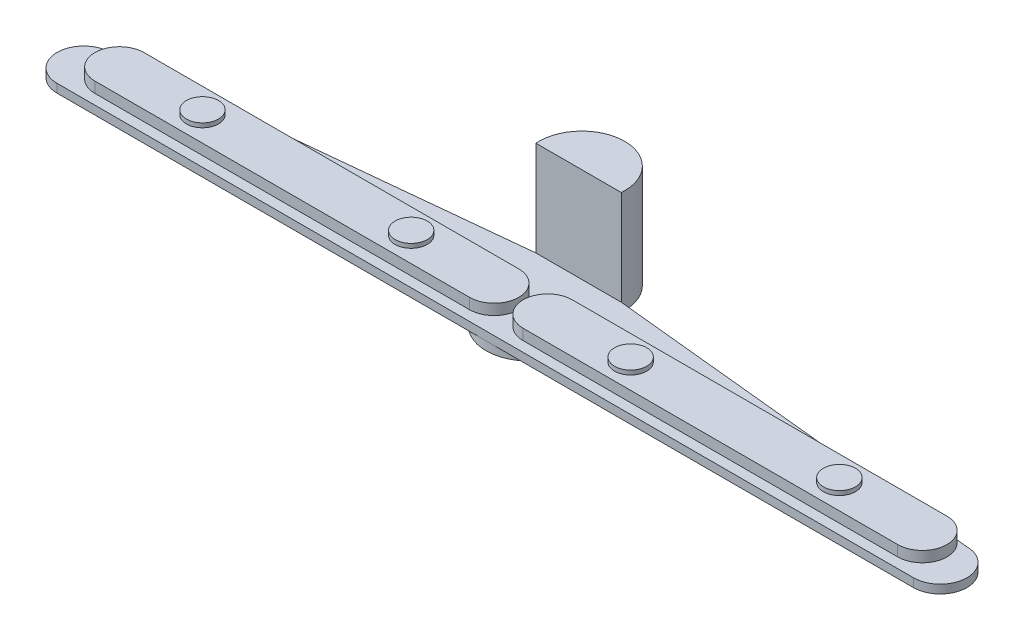
ISO-10303-21;
HEADER;
FILE_DESCRIPTION(('STEP AP214'),'2;1');
FILE_NAME('part.step','',(''),(''),'','','');
FILE_SCHEMA(('AUTOMOTIVE_DESIGN { 1 0 10303 214 1 1 1 1 }'));
ENDSEC;
DATA;
#1=APPLICATION_CONTEXT('core data for automotive mechanical design processes');
#2=APPLICATION_PROTOCOL_DEFINITION('international standard','automotive_design',2000,#1);
#3=PRODUCT_CONTEXT('',#1,'mechanical');
#4=PRODUCT('Part','Part','',(#3));
#5=PRODUCT_RELATED_PRODUCT_CATEGORY('part','',(#4));
#6=PRODUCT_DEFINITION_FORMATION('','',#4);
#7=PRODUCT_DEFINITION_CONTEXT('part definition',#1,'design');
#8=PRODUCT_DEFINITION('design','',#6,#7);
#9=PRODUCT_DEFINITION_SHAPE('','',#8);
#10=(LENGTH_UNIT() NAMED_UNIT(*) SI_UNIT(.MILLI.,.METRE.));
#11=(NAMED_UNIT(*) PLANE_ANGLE_UNIT() SI_UNIT($,.RADIAN.));
#12=(NAMED_UNIT(*) SI_UNIT($,.STERADIAN.) SOLID_ANGLE_UNIT());
#13=UNCERTAINTY_MEASURE_WITH_UNIT(LENGTH_MEASURE(1.E-05),#10,'distance_accuracy_value','');
#14=(GEOMETRIC_REPRESENTATION_CONTEXT(3) GLOBAL_UNCERTAINTY_ASSIGNED_CONTEXT((#13)) GLOBAL_UNIT_ASSIGNED_CONTEXT((#10,
#11,#12)) REPRESENTATION_CONTEXT('',''));
#15=CARTESIAN_POINT('',(0.,0.,0.));
#16=DIRECTION('',(0.,0.,1.));
#17=DIRECTION('',(1.,0.,0.));
#18=AXIS2_PLACEMENT_3D('',#15,#16,#17);
#19=CARTESIAN_POINT('',(-1446.89535492094,40.,407.233116230003));
#20=DIRECTION('',(0.,1.,0.));
#21=DIRECTION('',(0.,0.,1.));
#22=AXIS2_PLACEMENT_3D('',#19,#20,#21);
#23=PLANE('',#22);
#24=DIRECTION('',(-0.994906857184754,0.,-0.100798539308642));
#25=VECTOR('',#24,1.);
#26=CARTESIAN_POINT('',(2553.06053303877,40.,282.233124013492));
#27=LINE('',#26,#25);
#28=CARTESIAN_POINT('',(2281.62856086851,40.,254.733116230003));
#29=VERTEX_POINT('',#28);
#30=CARTESIAN_POINT('',(756.636813568834,40.,100.229265467022));
#31=VERTEX_POINT('',#30);
#32=EDGE_CURVE('E282',#29,#31,#27,.T.);
#33=ORIENTED_EDGE('',*,*,#32,.T.);
#34=DIRECTION('',(1.,0.,0.));
#35=VECTOR('',#34,1.);
#36=CARTESIAN_POINT('',(756.636813568834,40.,100.229265467022));
#37=LINE('',#36,#35);
#38=CARTESIAN_POINT('',(357.756813568834,40.,100.229265467022));
#39=VERTEX_POINT('',#38);
#40=EDGE_CURVE('E170',#39,#31,#37,.T.);
#41=ORIENTED_EDGE('',*,*,#40,.F.);
#42=DIRECTION('',(-0.994891530483461,0.,0.100949703180724));
#43=VECTOR('',#42,1.);
#44=CARTESIAN_POINT('',(-1438.63923170271,40.,282.5060685242));
#45=LINE('',#44,#43);
#46=CARTESIAN_POINT('',(-1164.92792653372,40.,254.733116230003));
#47=VERTEX_POINT('',#46);
#48=EDGE_CURVE('E288',#39,#47,#45,.T.);
#49=ORIENTED_EDGE('',*,*,#48,.T.);
#50=DIRECTION('',(-1.,0.,0.));
#51=VECTOR('',#50,1.);
#52=CARTESIAN_POINT('',(-1317.80318643117,40.,254.733116230003));
#53=LINE('',#52,#51);
#54=CARTESIAN_POINT('',(432.196813568834,40.,254.733116230003));
#55=VERTEX_POINT('',#54);
#56=EDGE_CURVE('E226',#55,#47,#53,.T.);
#57=ORIENTED_EDGE('',*,*,#56,.F.);
#58=CARTESIAN_POINT('',(432.196813568834,40.,369.733116230003));
#59=DIRECTION('',(0.,1.,0.));
#60=DIRECTION('',(0.,0.,1.));
#61=AXIS2_PLACEMENT_3D('',#58,#59,#60);
#62=CIRCLE('',#61,115.);
#63=CARTESIAN_POINT('',(432.196813568834,40.,484.733116230003));
#64=VERTEX_POINT('',#63);
#65=EDGE_CURVE('E209',#64,#55,#62,.T.);
#66=ORIENTED_EDGE('',*,*,#65,.F.);
#67=DIRECTION('',(1.,0.,0.));
#68=VECTOR('',#67,1.);
#69=CARTESIAN_POINT('',(432.196813568834,40.,484.733116230003));
#70=LINE('',#69,#68);
#71=CARTESIAN_POINT('',(-1317.80318643117,40.,484.733116230003));
#72=VERTEX_POINT('',#71);
#73=EDGE_CURVE('E216',#72,#64,#70,.T.);
#74=ORIENTED_EDGE('',*,*,#73,.F.);
#75=CARTESIAN_POINT('',(-1317.80318643117,40.,369.733116230003));
#76=DIRECTION('',(0.,1.,0.));
#77=DIRECTION('',(0.,0.,1.));
#78=AXIS2_PLACEMENT_3D('',#75,#76,#77);
#79=CIRCLE('',#78,115.);
#80=CARTESIAN_POINT('',(-1386.04516728354,40.,277.169451386045));
#81=VERTEX_POINT('',#80);
#82=EDGE_CURVE('E11',#72,#81,#79,.F.);
#83=ORIENTED_EDGE('',*,*,#82,.T.);
#84=CARTESIAN_POINT('',(-1438.63923170271,40.,282.5060685242));
#85=VERTEX_POINT('',#84);
#86=EDGE_CURVE('E286',#81,#85,#45,.T.);
#87=ORIENTED_EDGE('',*,*,#86,.T.);
#88=CARTESIAN_POINT('',(-1446.89535492094,40.,407.233116230003));
#89=DIRECTION('',(0.,1.,0.));
#90=DIRECTION('',(0.,0.,1.));
#91=AXIS2_PLACEMENT_3D('',#88,#89,#90);
#92=CIRCLE('',#91,125.);
#93=CARTESIAN_POINT('',(-1446.89535492094,40.,532.233116230003));
#94=VERTEX_POINT('',#93);
#95=EDGE_CURVE('E274',#85,#94,#92,.T.);
#96=ORIENTED_EDGE('',*,*,#95,.T.);
#97=DIRECTION('',(1.,0.,0.));
#98=VECTOR('',#97,1.);
#99=CARTESIAN_POINT('',(-1446.89535492094,40.,532.233116230003));
#100=LINE('',#99,#98);
#101=CARTESIAN_POINT('',(2553.10464507906,40.,532.233116230002));
#102=VERTEX_POINT('',#101);
#103=EDGE_CURVE('E277',#94,#102,#100,.T.);
#104=ORIENTED_EDGE('',*,*,#103,.T.);
#105=CARTESIAN_POINT('',(2553.10464507906,40.,407.233116230003));
#106=DIRECTION('',(0.,1.,0.));
#107=DIRECTION('',(0.,0.,1.));
#108=AXIS2_PLACEMENT_3D('',#105,#106,#107);
#109=CIRCLE('',#108,125.);
#110=CARTESIAN_POINT('',(2553.06053303877,40.,282.233124013492));
#111=VERTEX_POINT('',#110);
#112=EDGE_CURVE('E280',#102,#111,#109,.T.);
#113=ORIENTED_EDGE('',*,*,#112,.T.);
#114=CARTESIAN_POINT('',(2500.01553383146,40.,276.858893854043));
#115=VERTEX_POINT('',#114);
#116=EDGE_CURVE('E283',#111,#115,#27,.T.);
#117=ORIENTED_EDGE('',*,*,#116,.T.);
#118=CARTESIAN_POINT('',(2432.19681356883,40.,369.733116230003));
#119=DIRECTION('',(0.,1.,0.));
#120=DIRECTION('',(0.,0.,1.));
#121=AXIS2_PLACEMENT_3D('',#118,#119,#120);
#122=CIRCLE('',#121,115.);
#123=CARTESIAN_POINT('',(2432.19681356883,40.,484.733116230003));
#124=VERTEX_POINT('',#123);
#125=EDGE_CURVE('E257',#124,#115,#122,.T.);
#126=ORIENTED_EDGE('',*,*,#125,.F.);
#127=DIRECTION('',(1.,0.,0.));
#128=VECTOR('',#127,1.);
#129=CARTESIAN_POINT('',(682.196813568834,40.,484.733116230003));
#130=LINE('',#129,#128);
#131=CARTESIAN_POINT('',(682.196813568834,40.,484.733116230003));
#132=VERTEX_POINT('',#131);
#133=EDGE_CURVE('E253',#132,#124,#130,.T.);
#134=ORIENTED_EDGE('',*,*,#133,.F.);
#135=CARTESIAN_POINT('',(682.196813568834,40.,369.733116230003));
#136=DIRECTION('',(0.,1.,0.));
#137=DIRECTION('',(0.,0.,1.));
#138=AXIS2_PLACEMENT_3D('',#135,#136,#137);
#139=CIRCLE('',#138,115.);
#140=CARTESIAN_POINT('',(682.196813568834,40.,254.733116230003));
#141=VERTEX_POINT('',#140);
#142=EDGE_CURVE('E56',#141,#132,#139,.T.);
#143=ORIENTED_EDGE('',*,*,#142,.F.);
#144=DIRECTION('',(-1.,0.,0.));
#145=VECTOR('',#144,1.);
#146=CARTESIAN_POINT('',(682.196813568834,40.,254.733116230003));
#147=LINE('',#146,#145);
#148=EDGE_CURVE('E41',#29,#141,#147,.T.);
#149=ORIENTED_EDGE('',*,*,#148,.F.);
#150=EDGE_LOOP('',(#33,#41,#49,#57,#66,#74,#83,#87,#96,#104,#113,#117,#126,#134,#143,#149));
#151=FACE_BOUND('',#150,.T.);
#152=ADVANCED_FACE('F33',(#151),#23,.T.);
#153=CARTESIAN_POINT('',(-1446.89535492094,40.,407.233116230003));
#154=DIRECTION('',(0.,-1.,0.));
#155=DIRECTION('',(0.,0.,-1.));
#156=AXIS2_PLACEMENT_3D('',#153,#154,#155);
#157=CYLINDRICAL_SURFACE('',#156,125.);
#158=CARTESIAN_POINT('',(-1446.89535492094,0.,407.233116230003));
#159=DIRECTION('',(0.,1.,0.));
#160=DIRECTION('',(0.,0.,1.));
#161=AXIS2_PLACEMENT_3D('',#158,#159,#160);
#162=CIRCLE('',#161,125.);
#163=CARTESIAN_POINT('',(-1438.63923170271,0.,282.5060685242));
#164=VERTEX_POINT('',#163);
#165=CARTESIAN_POINT('',(-1446.89535492094,0.,532.233116230003));
#166=VERTEX_POINT('',#165);
#167=EDGE_CURVE('E273',#164,#166,#162,.T.);
#168=ORIENTED_EDGE('',*,*,#167,.T.);
#169=DIRECTION('',(0.,-1.,0.));
#170=VECTOR('',#169,1.);
#171=CARTESIAN_POINT('',(-1446.89535492094,40.,532.233116230003));
#172=LINE('',#171,#170);
#173=EDGE_CURVE('E316',#94,#166,#172,.T.);
#174=ORIENTED_EDGE('',*,*,#173,.F.);
#175=ORIENTED_EDGE('',*,*,#95,.F.);
#176=DIRECTION('',(0.,-1.,0.));
#177=VECTOR('',#176,1.);
#178=CARTESIAN_POINT('',(-1438.63923170271,40.,282.5060685242));
#179=LINE('',#178,#177);
#180=EDGE_CURVE('E291',#85,#164,#179,.T.);
#181=ORIENTED_EDGE('',*,*,#180,.T.);
#182=EDGE_LOOP('',(#168,#174,#175,#181));
#183=FACE_BOUND('',#182,.T.);
#184=ADVANCED_FACE('F35',(#183),#157,.T.);
#185=CARTESIAN_POINT('',(-1446.89535492094,40.,532.233116230003));
#186=DIRECTION('',(0.,0.,-1.));
#187=DIRECTION('',(-1.,0.,0.));
#188=AXIS2_PLACEMENT_3D('',#185,#186,#187);
#189=PLANE('',#188);
#190=DIRECTION('',(1.,0.,0.));
#191=VECTOR('',#190,1.);
#192=CARTESIAN_POINT('',(-1446.89535492094,0.,532.233116230003));
#193=LINE('',#192,#191);
#194=CARTESIAN_POINT('',(557.196813568834,0.,532.233116230002));
#195=VERTEX_POINT('',#194);
#196=EDGE_CURVE('E296',#166,#195,#193,.T.);
#197=ORIENTED_EDGE('',*,*,#196,.T.);
#198=CARTESIAN_POINT('',(2553.10464507906,0.,532.233116230002));
#199=VERTEX_POINT('',#198);
#200=EDGE_CURVE('E295',#195,#199,#193,.T.);
#201=ORIENTED_EDGE('',*,*,#200,.T.);
#202=DIRECTION('',(0.,-1.,0.));
#203=VECTOR('',#202,1.);
#204=CARTESIAN_POINT('',(2553.10464507906,40.,532.233116230002));
#205=LINE('',#204,#203);
#206=EDGE_CURVE('E314',#102,#199,#205,.T.);
#207=ORIENTED_EDGE('',*,*,#206,.F.);
#208=ORIENTED_EDGE('',*,*,#103,.F.);
#209=ORIENTED_EDGE('',*,*,#173,.T.);
#210=EDGE_LOOP('',(#197,#201,#207,#208,#209));
#211=FACE_BOUND('',#210,.T.);
#212=ADVANCED_FACE('F400',(#211),#189,.F.);
#213=CARTESIAN_POINT('',(2553.10464507906,40.,407.233116230003));
#214=DIRECTION('',(0.,-1.,0.));
#215=DIRECTION('',(0.,0.,-1.));
#216=AXIS2_PLACEMENT_3D('',#213,#214,#215);
#217=CYLINDRICAL_SURFACE('',#216,125.);
#218=CARTESIAN_POINT('',(2553.10464507906,0.,407.233116230003));
#219=DIRECTION('',(0.,1.,0.));
#220=DIRECTION('',(0.,0.,1.));
#221=AXIS2_PLACEMENT_3D('',#218,#219,#220);
#222=CIRCLE('',#221,125.);
#223=CARTESIAN_POINT('',(2553.06053303877,0.,282.233124013492));
#224=VERTEX_POINT('',#223);
#225=EDGE_CURVE('E298',#199,#224,#222,.T.);
#226=ORIENTED_EDGE('',*,*,#225,.T.);
#227=DIRECTION('',(0.,-1.,0.));
#228=VECTOR('',#227,1.);
#229=CARTESIAN_POINT('',(2553.06053303877,40.,282.233124013492));
#230=LINE('',#229,#228);
#231=EDGE_CURVE('E311',#111,#224,#230,.T.);
#232=ORIENTED_EDGE('',*,*,#231,.F.);
#233=ORIENTED_EDGE('',*,*,#112,.F.);
#234=ORIENTED_EDGE('',*,*,#206,.T.);
#235=EDGE_LOOP('',(#226,#232,#233,#234));
#236=FACE_BOUND('',#235,.T.);
#237=ADVANCED_FACE('F412',(#236),#217,.T.);
#238=CARTESIAN_POINT('',(2553.06053303877,40.,282.233124013492));
#239=DIRECTION('',(-0.100798539308642,0.,0.994906857184754));
#240=DIRECTION('',(0.994906857184754,0.,0.100798539308642));
#241=AXIS2_PLACEMENT_3D('',#238,#239,#240);
#242=PLANE('',#241);
#243=DIRECTION('',(-0.994906857184754,0.,-0.100798539308642));
#244=VECTOR('',#243,1.);
#245=CARTESIAN_POINT('',(2553.06053303877,0.,282.233124013492));
#246=LINE('',#245,#244);
#247=CARTESIAN_POINT('',(756.636813568834,0.,100.229265467022));
#248=VERTEX_POINT('',#247);
#249=EDGE_CURVE('E300',#224,#248,#246,.T.);
#250=ORIENTED_EDGE('',*,*,#249,.T.);
#251=DIRECTION('',(0.,-1.,0.));
#252=VECTOR('',#251,1.);
#253=CARTESIAN_POINT('',(756.636813568834,40.,100.229265467022));
#254=LINE('',#253,#252);
#255=EDGE_CURVE('E308',#31,#248,#254,.T.);
#256=ORIENTED_EDGE('',*,*,#255,.F.);
#257=ORIENTED_EDGE('',*,*,#32,.F.);
#258=EDGE_CURVE('E287',#115,#29,#27,.T.);
#259=ORIENTED_EDGE('',*,*,#258,.F.);
#260=ORIENTED_EDGE('',*,*,#116,.F.);
#261=ORIENTED_EDGE('',*,*,#231,.T.);
#262=EDGE_LOOP('',(#250,#256,#257,#259,#260,#261));
#263=FACE_BOUND('',#262,.T.);
#264=ADVANCED_FACE('F343',(#263),#242,.F.);
#265=CARTESIAN_POINT('',(557.196813568834,40.,85.2731162300026));
#266=DIRECTION('',(0.,-1.,0.));
#267=DIRECTION('',(0.,0.,-1.));
#268=AXIS2_PLACEMENT_3D('',#265,#266,#267);
#269=CYLINDRICAL_SURFACE('',#268,200.);
#270=CARTESIAN_POINT('',(557.196813568834,0.,85.2731162300026));
#271=DIRECTION('',(0.,1.,0.));
#272=DIRECTION('',(0.,0.,1.));
#273=AXIS2_PLACEMENT_3D('',#270,#271,#272);
#274=CIRCLE('',#273,200.);
#275=CARTESIAN_POINT('',(357.756813568834,0.,100.229265467022));
#276=VERTEX_POINT('',#275);
#277=EDGE_CURVE('E302',#248,#276,#274,.T.);
#278=ORIENTED_EDGE('',*,*,#277,.T.);
#279=DIRECTION('',(0.,-1.,0.));
#280=VECTOR('',#279,1.);
#281=CARTESIAN_POINT('',(357.756813568834,40.,100.229265467022));
#282=LINE('',#281,#280);
#283=EDGE_CURVE('E175',#39,#276,#282,.T.);
#284=ORIENTED_EDGE('',*,*,#283,.F.);
#285=DIRECTION('',(0.,-1.,0.));
#286=VECTOR('',#285,1.);
#287=CARTESIAN_POINT('',(357.756813568834,484.,100.229265467022));
#288=LINE('',#287,#286);
#289=CARTESIAN_POINT('',(357.756813568834,484.,100.229265467022));
#290=VERTEX_POINT('',#289);
#291=EDGE_CURVE('E161',#290,#39,#288,.T.);
#292=ORIENTED_EDGE('',*,*,#291,.F.);
#293=CARTESIAN_POINT('',(557.196813568834,484.,85.2731162300026));
#294=DIRECTION('',(0.,1.,0.));
#295=DIRECTION('',(0.,0.,1.));
#296=AXIS2_PLACEMENT_3D('',#293,#294,#295);
#297=CIRCLE('',#296,200.);
#298=CARTESIAN_POINT('',(756.636813568834,484.,100.229265467022));
#299=VERTEX_POINT('',#298);
#300=EDGE_CURVE('E166',#299,#290,#297,.T.);
#301=ORIENTED_EDGE('',*,*,#300,.F.);
#302=DIRECTION('',(0.,-1.,0.));
#303=VECTOR('',#302,1.);
#304=CARTESIAN_POINT('',(756.636813568834,484.,100.229265467022));
#305=LINE('',#304,#303);
#306=EDGE_CURVE('E163',#299,#31,#305,.T.);
#307=ORIENTED_EDGE('',*,*,#306,.T.);
#308=ORIENTED_EDGE('',*,*,#255,.T.);
#309=EDGE_LOOP('',(#278,#284,#292,#301,#307,#308));
#310=FACE_BOUND('',#309,.T.);
#311=ADVANCED_FACE('F173',(#310),#269,.T.);
#312=CARTESIAN_POINT('',(-1438.63923170271,40.,282.5060685242));
#313=DIRECTION('',(0.100949703180724,0.,0.994891530483461));
#314=DIRECTION('',(0.994891530483461,0.,-0.100949703180724));
#315=AXIS2_PLACEMENT_3D('',#312,#313,#314);
#316=PLANE('',#315);
#317=DIRECTION('',(-0.994891530483461,0.,0.100949703180724));
#318=VECTOR('',#317,1.);
#319=CARTESIAN_POINT('',(-1438.63923170271,0.,282.5060685242));
#320=LINE('',#319,#318);
#321=EDGE_CURVE('E278',#276,#164,#320,.T.);
#322=ORIENTED_EDGE('',*,*,#321,.T.);
#323=ORIENTED_EDGE('',*,*,#180,.F.);
#324=ORIENTED_EDGE('',*,*,#86,.F.);
#325=EDGE_CURVE('E292',#47,#81,#45,.T.);
#326=ORIENTED_EDGE('',*,*,#325,.F.);
#327=ORIENTED_EDGE('',*,*,#48,.F.);
#328=ORIENTED_EDGE('',*,*,#283,.T.);
#329=EDGE_LOOP('',(#322,#323,#324,#326,#327,#328));
#330=FACE_BOUND('',#329,.T.);
#331=ADVANCED_FACE('F354',(#330),#316,.F.);
#332=CARTESIAN_POINT('',(-1446.89535492094,0.,407.233116230003));
#333=DIRECTION('',(0.,1.,0.));
#334=DIRECTION('',(0.,0.,1.));
#335=AXIS2_PLACEMENT_3D('',#332,#333,#334);
#336=PLANE('',#335);
#337=ORIENTED_EDGE('',*,*,#200,.F.);
#338=CARTESIAN_POINT('',(557.196813568834,0.,332.233116230002));
#339=DIRECTION('',(0.,-1.,0.));
#340=DIRECTION('',(0.,0.,-1.));
#341=AXIS2_PLACEMENT_3D('',#338,#339,#340);
#342=CIRCLE('',#341,200.);
#343=EDGE_CURVE('E177',#195,#195,#342,.T.);
#344=ORIENTED_EDGE('',*,*,#343,.F.);
#345=ORIENTED_EDGE('',*,*,#196,.F.);
#346=ORIENTED_EDGE('',*,*,#167,.F.);
#347=ORIENTED_EDGE('',*,*,#321,.F.);
#348=ORIENTED_EDGE('',*,*,#277,.F.);
#349=ORIENTED_EDGE('',*,*,#249,.F.);
#350=ORIENTED_EDGE('',*,*,#225,.F.);
#351=EDGE_LOOP('',(#337,#344,#345,#346,#347,#348,#349,#350));
#352=FACE_BOUND('',#351,.T.);
#353=ADVANCED_FACE('F349',(#352),#336,.F.);
#354=CARTESIAN_POINT('',(682.196813568834,40.,369.733116230003));
#355=DIRECTION('',(0.,1.,0.));
#356=DIRECTION('',(0.,0.,1.));
#357=AXIS2_PLACEMENT_3D('',#354,#355,#356);
#358=PLANE('',#357);
#359=CARTESIAN_POINT('',(2432.19681356883,40.,254.733116230002));
#360=VERTEX_POINT('',#359);
#361=EDGE_CURVE('E256',#115,#360,#122,.T.);
#362=ORIENTED_EDGE('',*,*,#361,.F.);
#363=ORIENTED_EDGE('',*,*,#258,.T.);
#364=EDGE_CURVE('E245',#360,#29,#147,.T.);
#365=ORIENTED_EDGE('',*,*,#364,.F.);
#366=EDGE_LOOP('',(#362,#363,#365));
#367=FACE_BOUND('',#366,.T.);
#368=ADVANCED_FACE('F339',(#367),#358,.F.);
#369=CARTESIAN_POINT('',(682.196813568834,90.,369.733116230003));
#370=DIRECTION('',(0.,-1.,0.));
#371=DIRECTION('',(0.,0.,-1.));
#372=AXIS2_PLACEMENT_3D('',#369,#370,#371);
#373=CYLINDRICAL_SURFACE('',#372,115.);
#374=ORIENTED_EDGE('',*,*,#142,.T.);
#375=DIRECTION('',(0.,-1.,0.));
#376=VECTOR('',#375,1.);
#377=CARTESIAN_POINT('',(682.196813568834,90.,484.733116230003));
#378=LINE('',#377,#376);
#379=CARTESIAN_POINT('',(682.196813568834,90.,484.733116230003));
#380=VERTEX_POINT('',#379);
#381=EDGE_CURVE('E270',#380,#132,#378,.T.);
#382=ORIENTED_EDGE('',*,*,#381,.F.);
#383=CARTESIAN_POINT('',(682.196813568834,90.,369.733116230003));
#384=DIRECTION('',(0.,1.,0.));
#385=DIRECTION('',(0.,0.,1.));
#386=AXIS2_PLACEMENT_3D('',#383,#384,#385);
#387=CIRCLE('',#386,115.);
#388=CARTESIAN_POINT('',(682.196813568834,90.,254.733116230003));
#389=VERTEX_POINT('',#388);
#390=EDGE_CURVE('E241',#389,#380,#387,.T.);
#391=ORIENTED_EDGE('',*,*,#390,.F.);
#392=DIRECTION('',(0.,-1.,0.));
#393=VECTOR('',#392,1.);
#394=CARTESIAN_POINT('',(682.196813568834,90.,254.733116230003));
#395=LINE('',#394,#393);
#396=EDGE_CURVE('E251',#389,#141,#395,.T.);
#397=ORIENTED_EDGE('',*,*,#396,.T.);
#398=EDGE_LOOP('',(#374,#382,#391,#397));
#399=FACE_BOUND('',#398,.T.);
#400=ADVANCED_FACE('F328',(#399),#373,.T.);
#401=CARTESIAN_POINT('',(682.196813568834,90.,484.733116230003));
#402=DIRECTION('',(0.,0.,-1.));
#403=DIRECTION('',(-1.,0.,0.));
#404=AXIS2_PLACEMENT_3D('',#401,#402,#403);
#405=PLANE('',#404);
#406=ORIENTED_EDGE('',*,*,#133,.T.);
#407=DIRECTION('',(0.,-1.,0.));
#408=VECTOR('',#407,1.);
#409=CARTESIAN_POINT('',(2432.19681356883,90.,484.733116230003));
#410=LINE('',#409,#408);
#411=CARTESIAN_POINT('',(2432.19681356883,90.,484.733116230003));
#412=VERTEX_POINT('',#411);
#413=EDGE_CURVE('E267',#412,#124,#410,.T.);
#414=ORIENTED_EDGE('',*,*,#413,.F.);
#415=DIRECTION('',(1.,0.,0.));
#416=VECTOR('',#415,1.);
#417=CARTESIAN_POINT('',(682.196813568834,90.,484.733116230003));
#418=LINE('',#417,#416);
#419=EDGE_CURVE('E244',#380,#412,#418,.T.);
#420=ORIENTED_EDGE('',*,*,#419,.F.);
#421=ORIENTED_EDGE('',*,*,#381,.T.);
#422=EDGE_LOOP('',(#406,#414,#420,#421));
#423=FACE_BOUND('',#422,.T.);
#424=ADVANCED_FACE('F422',(#423),#405,.F.);
#425=CARTESIAN_POINT('',(2432.19681356883,90.,369.733116230003));
#426=DIRECTION('',(0.,-1.,0.));
#427=DIRECTION('',(0.,0.,-1.));
#428=AXIS2_PLACEMENT_3D('',#425,#426,#427);
#429=CYLINDRICAL_SURFACE('',#428,115.);
#430=ORIENTED_EDGE('',*,*,#125,.T.);
#431=ORIENTED_EDGE('',*,*,#361,.T.);
#432=DIRECTION('',(0.,-1.,0.));
#433=VECTOR('',#432,1.);
#434=CARTESIAN_POINT('',(2432.19681356883,90.,254.733116230002));
#435=LINE('',#434,#433);
#436=CARTESIAN_POINT('',(2432.19681356883,90.,254.733116230002));
#437=VERTEX_POINT('',#436);
#438=EDGE_CURVE('E264',#437,#360,#435,.T.);
#439=ORIENTED_EDGE('',*,*,#438,.F.);
#440=CARTESIAN_POINT('',(2432.19681356883,90.,369.733116230003));
#441=DIRECTION('',(0.,1.,0.));
#442=DIRECTION('',(0.,0.,1.));
#443=AXIS2_PLACEMENT_3D('',#440,#441,#442);
#444=CIRCLE('',#443,115.);
#445=EDGE_CURVE('E247',#412,#437,#444,.T.);
#446=ORIENTED_EDGE('',*,*,#445,.F.);
#447=ORIENTED_EDGE('',*,*,#413,.T.);
#448=EDGE_LOOP('',(#430,#431,#439,#446,#447));
#449=FACE_BOUND('',#448,.T.);
#450=ADVANCED_FACE('F423',(#449),#429,.T.);
#451=CARTESIAN_POINT('',(682.196813568834,90.,254.733116230003));
#452=DIRECTION('',(0.,0.,1.));
#453=DIRECTION('',(1.,0.,0.));
#454=AXIS2_PLACEMENT_3D('',#451,#452,#453);
#455=PLANE('',#454);
#456=ORIENTED_EDGE('',*,*,#364,.T.);
#457=ORIENTED_EDGE('',*,*,#148,.T.);
#458=ORIENTED_EDGE('',*,*,#396,.F.);
#459=DIRECTION('',(-1.,0.,0.));
#460=VECTOR('',#459,1.);
#461=CARTESIAN_POINT('',(682.196813568834,90.,254.733116230003));
#462=LINE('',#461,#460);
#463=EDGE_CURVE('E249',#437,#389,#462,.T.);
#464=ORIENTED_EDGE('',*,*,#463,.F.);
#465=ORIENTED_EDGE('',*,*,#438,.T.);
#466=EDGE_LOOP('',(#456,#457,#458,#464,#465));
#467=FACE_BOUND('',#466,.T.);
#468=ADVANCED_FACE('F322',(#467),#455,.F.);
#469=CARTESIAN_POINT('',(682.196813568834,90.,369.733116230003));
#470=DIRECTION('',(0.,1.,0.));
#471=DIRECTION('',(0.,0.,1.));
#472=AXIS2_PLACEMENT_3D('',#469,#470,#471);
#473=PLANE('',#472);
#474=CARTESIAN_POINT('',(2044.69681356883,90.,369.733116230002));
#475=DIRECTION('',(0.,1.,0.));
#476=DIRECTION('',(0.,0.,1.));
#477=AXIS2_PLACEMENT_3D('',#474,#475,#476);
#478=CIRCLE('',#477,75.);
#479=CARTESIAN_POINT('',(2044.69681356883,90.,444.733116230002));
#480=VERTEX_POINT('',#479);
#481=EDGE_CURVE('E186',#480,#480,#478,.T.);
#482=ORIENTED_EDGE('',*,*,#481,.F.);
#483=EDGE_LOOP('',(#482));
#484=FACE_BOUND('',#483,.T.);
#485=CARTESIAN_POINT('',(1069.69681356883,90.,369.733116230002));
#486=DIRECTION('',(0.,1.,0.));
#487=DIRECTION('',(0.,0.,1.));
#488=AXIS2_PLACEMENT_3D('',#485,#486,#487);
#489=CIRCLE('',#488,75.0000000000002);
#490=CARTESIAN_POINT('',(1069.69681356883,90.,444.733116230003));
#491=VERTEX_POINT('',#490);
#492=EDGE_CURVE('E191',#491,#491,#489,.T.);
#493=ORIENTED_EDGE('',*,*,#492,.F.);
#494=EDGE_LOOP('',(#493));
#495=FACE_BOUND('',#494,.T.);
#496=ORIENTED_EDGE('',*,*,#390,.T.);
#497=ORIENTED_EDGE('',*,*,#419,.T.);
#498=ORIENTED_EDGE('',*,*,#445,.T.);
#499=ORIENTED_EDGE('',*,*,#463,.T.);
#500=EDGE_LOOP('',(#496,#497,#498,#499));
#501=FACE_BOUND('',#500,.T.);
#502=ADVANCED_FACE('F331',(#484,#495,#501),#473,.T.);
#503=CARTESIAN_POINT('',(432.196813568834,40.,369.733116230003));
#504=DIRECTION('',(0.,1.,0.));
#505=DIRECTION('',(0.,0.,1.));
#506=AXIS2_PLACEMENT_3D('',#503,#504,#505);
#507=PLANE('',#506);
#508=CARTESIAN_POINT('',(-1317.80318643117,40.,254.733116230003));
#509=VERTEX_POINT('',#508);
#510=EDGE_CURVE('E225',#47,#509,#53,.T.);
#511=ORIENTED_EDGE('',*,*,#510,.F.);
#512=ORIENTED_EDGE('',*,*,#325,.T.);
#513=CARTESIAN_POINT('',(-1317.80318643117,40.,369.733116230003));
#514=DIRECTION('',(0.,1.,0.));
#515=DIRECTION('',(0.,0.,1.));
#516=AXIS2_PLACEMENT_3D('',#513,#514,#515);
#517=CIRCLE('',#516,115.);
#518=EDGE_CURVE('E229',#509,#81,#517,.T.);
#519=ORIENTED_EDGE('',*,*,#518,.F.);
#520=EDGE_LOOP('',(#511,#512,#519));
#521=FACE_BOUND('',#520,.T.);
#522=ADVANCED_FACE('F363',(#521),#507,.F.);
#523=CARTESIAN_POINT('',(432.196813568834,90.,369.733116230003));
#524=DIRECTION('',(0.,-1.,0.));
#525=DIRECTION('',(0.,0.,-1.));
#526=AXIS2_PLACEMENT_3D('',#523,#524,#525);
#527=CYLINDRICAL_SURFACE('',#526,115.);
#528=ORIENTED_EDGE('',*,*,#65,.T.);
#529=DIRECTION('',(0.,-1.,0.));
#530=VECTOR('',#529,1.);
#531=CARTESIAN_POINT('',(432.196813568834,90.,254.733116230003));
#532=LINE('',#531,#530);
#533=CARTESIAN_POINT('',(432.196813568834,90.,254.733116230003));
#534=VERTEX_POINT('',#533);
#535=EDGE_CURVE('E239',#534,#55,#532,.T.);
#536=ORIENTED_EDGE('',*,*,#535,.F.);
#537=CARTESIAN_POINT('',(432.196813568834,90.,369.733116230003));
#538=DIRECTION('',(0.,1.,0.));
#539=DIRECTION('',(0.,0.,1.));
#540=AXIS2_PLACEMENT_3D('',#537,#538,#539);
#541=CIRCLE('',#540,115.);
#542=CARTESIAN_POINT('',(432.196813568834,90.,484.733116230003));
#543=VERTEX_POINT('',#542);
#544=EDGE_CURVE('E212',#543,#534,#541,.T.);
#545=ORIENTED_EDGE('',*,*,#544,.F.);
#546=DIRECTION('',(0.,-1.,0.));
#547=VECTOR('',#546,1.);
#548=CARTESIAN_POINT('',(432.196813568834,90.,484.733116230003));
#549=LINE('',#548,#547);
#550=EDGE_CURVE('E222',#543,#64,#549,.T.);
#551=ORIENTED_EDGE('',*,*,#550,.T.);
#552=EDGE_LOOP('',(#528,#536,#545,#551));
#553=FACE_BOUND('',#552,.T.);
#554=ADVANCED_FACE('F374',(#553),#527,.T.);
#555=CARTESIAN_POINT('',(-1317.80318643117,90.,254.733116230003));
#556=DIRECTION('',(0.,0.,1.));
#557=DIRECTION('',(1.,0.,0.));
#558=AXIS2_PLACEMENT_3D('',#555,#556,#557);
#559=PLANE('',#558);
#560=ORIENTED_EDGE('',*,*,#56,.T.);
#561=ORIENTED_EDGE('',*,*,#510,.T.);
#562=DIRECTION('',(0.,-1.,0.));
#563=VECTOR('',#562,1.);
#564=CARTESIAN_POINT('',(-1317.80318643117,90.,254.733116230003));
#565=LINE('',#564,#563);
#566=CARTESIAN_POINT('',(-1317.80318643117,90.,254.733116230003));
#567=VERTEX_POINT('',#566);
#568=EDGE_CURVE('E236',#567,#509,#565,.T.);
#569=ORIENTED_EDGE('',*,*,#568,.F.);
#570=DIRECTION('',(-1.,0.,0.));
#571=VECTOR('',#570,1.);
#572=CARTESIAN_POINT('',(-1317.80318643117,90.,254.733116230003));
#573=LINE('',#572,#571);
#574=EDGE_CURVE('E215',#534,#567,#573,.T.);
#575=ORIENTED_EDGE('',*,*,#574,.F.);
#576=ORIENTED_EDGE('',*,*,#535,.T.);
#577=EDGE_LOOP('',(#560,#561,#569,#575,#576));
#578=FACE_BOUND('',#577,.T.);
#579=ADVANCED_FACE('F369',(#578),#559,.F.);
#580=CARTESIAN_POINT('',(-1317.80318643117,90.,369.733116230003));
#581=DIRECTION('',(0.,-1.,0.));
#582=DIRECTION('',(0.,0.,-1.));
#583=AXIS2_PLACEMENT_3D('',#580,#581,#582);
#584=CYLINDRICAL_SURFACE('',#583,115.);
#585=ORIENTED_EDGE('',*,*,#518,.T.);
#586=ORIENTED_EDGE('',*,*,#82,.F.);
#587=DIRECTION('',(0.,-1.,0.));
#588=VECTOR('',#587,1.);
#589=CARTESIAN_POINT('',(-1317.80318643117,90.,484.733116230003));
#590=LINE('',#589,#588);
#591=CARTESIAN_POINT('',(-1317.80318643117,90.,484.733116230003));
#592=VERTEX_POINT('',#591);
#593=EDGE_CURVE('E48',#592,#72,#590,.T.);
#594=ORIENTED_EDGE('',*,*,#593,.F.);
#595=CARTESIAN_POINT('',(-1317.80318643117,90.,369.733116230003));
#596=DIRECTION('',(0.,1.,0.));
#597=DIRECTION('',(0.,0.,1.));
#598=AXIS2_PLACEMENT_3D('',#595,#596,#597);
#599=CIRCLE('',#598,115.);
#600=EDGE_CURVE('E218',#567,#592,#599,.T.);
#601=ORIENTED_EDGE('',*,*,#600,.F.);
#602=ORIENTED_EDGE('',*,*,#568,.T.);
#603=EDGE_LOOP('',(#585,#586,#594,#601,#602));
#604=FACE_BOUND('',#603,.T.);
#605=ADVANCED_FACE('F365',(#604),#584,.T.);
#606=CARTESIAN_POINT('',(432.196813568834,90.,484.733116230003));
#607=DIRECTION('',(0.,0.,-1.));
#608=DIRECTION('',(-1.,0.,0.));
#609=AXIS2_PLACEMENT_3D('',#606,#607,#608);
#610=PLANE('',#609);
#611=ORIENTED_EDGE('',*,*,#73,.T.);
#612=ORIENTED_EDGE('',*,*,#550,.F.);
#613=DIRECTION('',(1.,0.,0.));
#614=VECTOR('',#613,1.);
#615=CARTESIAN_POINT('',(432.196813568834,90.,484.733116230003));
#616=LINE('',#615,#614);
#617=EDGE_CURVE('E220',#592,#543,#616,.T.);
#618=ORIENTED_EDGE('',*,*,#617,.F.);
#619=ORIENTED_EDGE('',*,*,#593,.T.);
#620=EDGE_LOOP('',(#611,#612,#618,#619));
#621=FACE_BOUND('',#620,.T.);
#622=ADVANCED_FACE('F377',(#621),#610,.F.);
#623=CARTESIAN_POINT('',(432.196813568834,90.,369.733116230003));
#624=DIRECTION('',(0.,1.,0.));
#625=DIRECTION('',(0.,0.,1.));
#626=AXIS2_PLACEMENT_3D('',#623,#624,#625);
#627=PLANE('',#626);
#628=CARTESIAN_POINT('',(44.6968135688339,90.,369.733116230002));
#629=DIRECTION('',(0.,1.,0.));
#630=DIRECTION('',(0.,0.,1.));
#631=AXIS2_PLACEMENT_3D('',#628,#629,#630);
#632=CIRCLE('',#631,75.);
#633=CARTESIAN_POINT('',(44.6968135688339,90.,444.733116230002));
#634=VERTEX_POINT('',#633);
#635=EDGE_CURVE('E197',#634,#634,#632,.T.);
#636=ORIENTED_EDGE('',*,*,#635,.F.);
#637=EDGE_LOOP('',(#636));
#638=FACE_BOUND('',#637,.T.);
#639=CARTESIAN_POINT('',(-930.303186431166,90.,369.733116230002));
#640=DIRECTION('',(0.,1.,0.));
#641=DIRECTION('',(0.,0.,1.));
#642=AXIS2_PLACEMENT_3D('',#639,#640,#641);
#643=CIRCLE('',#642,75.);
#644=CARTESIAN_POINT('',(-930.303186431166,90.,444.733116230002));
#645=VERTEX_POINT('',#644);
#646=EDGE_CURVE('E203',#645,#645,#643,.T.);
#647=ORIENTED_EDGE('',*,*,#646,.F.);
#648=EDGE_LOOP('',(#647));
#649=FACE_BOUND('',#648,.T.);
#650=ORIENTED_EDGE('',*,*,#544,.T.);
#651=ORIENTED_EDGE('',*,*,#574,.T.);
#652=ORIENTED_EDGE('',*,*,#600,.T.);
#653=ORIENTED_EDGE('',*,*,#617,.T.);
#654=EDGE_LOOP('',(#650,#651,#652,#653));
#655=FACE_BOUND('',#654,.T.);
#656=ADVANCED_FACE('F379',(#638,#649,#655),#627,.T.);
#657=CARTESIAN_POINT('',(-930.303186431166,110.,369.733116230002));
#658=DIRECTION('',(0.,-1.,0.));
#659=DIRECTION('',(0.,0.,-1.));
#660=AXIS2_PLACEMENT_3D('',#657,#658,#659);
#661=CYLINDRICAL_SURFACE('',#660,75.);
#662=CARTESIAN_POINT('',(-930.303186431166,110.,369.733116230002));
#663=DIRECTION('',(0.,1.,0.));
#664=DIRECTION('',(0.,0.,1.));
#665=AXIS2_PLACEMENT_3D('',#662,#663,#664);
#666=CIRCLE('',#665,75.);
#667=CARTESIAN_POINT('',(-930.303186431166,110.,444.733116230002));
#668=VERTEX_POINT('',#667);
#669=EDGE_CURVE('E206',#668,#668,#666,.T.);
#670=ORIENTED_EDGE('',*,*,#669,.F.);
#671=EDGE_LOOP('',(#670));
#672=FACE_BOUND('',#671,.T.);
#673=ORIENTED_EDGE('',*,*,#646,.T.);
#674=EDGE_LOOP('',(#673));
#675=FACE_BOUND('',#674,.T.);
#676=ADVANCED_FACE('F381',(#672,#675),#661,.T.);
#677=CARTESIAN_POINT('',(-930.303186431166,110.,369.733116230002));
#678=DIRECTION('',(0.,1.,0.));
#679=DIRECTION('',(0.,0.,1.));
#680=AXIS2_PLACEMENT_3D('',#677,#678,#679);
#681=PLANE('',#680);
#682=ORIENTED_EDGE('',*,*,#669,.T.);
#683=EDGE_LOOP('',(#682));
#684=FACE_BOUND('',#683,.T.);
#685=ADVANCED_FACE('F388',(#684),#681,.T.);
#686=CARTESIAN_POINT('',(44.6968135688339,110.,369.733116230002));
#687=DIRECTION('',(0.,-1.,0.));
#688=DIRECTION('',(0.,0.,-1.));
#689=AXIS2_PLACEMENT_3D('',#686,#687,#688);
#690=CYLINDRICAL_SURFACE('',#689,75.);
#691=CARTESIAN_POINT('',(44.6968135688339,110.,369.733116230002));
#692=DIRECTION('',(0.,1.,0.));
#693=DIRECTION('',(0.,0.,1.));
#694=AXIS2_PLACEMENT_3D('',#691,#692,#693);
#695=CIRCLE('',#694,75.);
#696=CARTESIAN_POINT('',(44.6968135688339,110.,444.733116230002));
#697=VERTEX_POINT('',#696);
#698=EDGE_CURVE('E200',#697,#697,#695,.T.);
#699=ORIENTED_EDGE('',*,*,#698,.F.);
#700=EDGE_LOOP('',(#699));
#701=FACE_BOUND('',#700,.T.);
#702=ORIENTED_EDGE('',*,*,#635,.T.);
#703=EDGE_LOOP('',(#702));
#704=FACE_BOUND('',#703,.T.);
#705=ADVANCED_FACE('F488',(#701,#704),#690,.T.);
#706=CARTESIAN_POINT('',(44.6968135688339,110.,369.733116230002));
#707=DIRECTION('',(0.,1.,0.));
#708=DIRECTION('',(0.,0.,1.));
#709=AXIS2_PLACEMENT_3D('',#706,#707,#708);
#710=PLANE('',#709);
#711=ORIENTED_EDGE('',*,*,#698,.T.);
#712=EDGE_LOOP('',(#711));
#713=FACE_BOUND('',#712,.T.);
#714=ADVANCED_FACE('F498',(#713),#710,.T.);
#715=CARTESIAN_POINT('',(1069.69681356883,110.,369.733116230002));
#716=DIRECTION('',(0.,-1.,0.));
#717=DIRECTION('',(0.,0.,-1.));
#718=AXIS2_PLACEMENT_3D('',#715,#716,#717);
#719=CYLINDRICAL_SURFACE('',#718,75.0000000000002);
#720=CARTESIAN_POINT('',(1069.69681356883,110.,369.733116230002));
#721=DIRECTION('',(0.,1.,0.));
#722=DIRECTION('',(0.,0.,1.));
#723=AXIS2_PLACEMENT_3D('',#720,#721,#722);
#724=CIRCLE('',#723,75.0000000000002);
#725=CARTESIAN_POINT('',(1069.69681356883,110.,444.733116230003));
#726=VERTEX_POINT('',#725);
#727=EDGE_CURVE('E194',#726,#726,#724,.T.);
#728=ORIENTED_EDGE('',*,*,#727,.F.);
#729=EDGE_LOOP('',(#728));
#730=FACE_BOUND('',#729,.T.);
#731=ORIENTED_EDGE('',*,*,#492,.T.);
#732=EDGE_LOOP('',(#731));
#733=FACE_BOUND('',#732,.T.);
#734=ADVANCED_FACE('F508',(#730,#733),#719,.T.);
#735=CARTESIAN_POINT('',(1069.69681356883,110.,369.733116230002));
#736=DIRECTION('',(0.,1.,0.));
#737=DIRECTION('',(0.,0.,1.));
#738=AXIS2_PLACEMENT_3D('',#735,#736,#737);
#739=PLANE('',#738);
#740=ORIENTED_EDGE('',*,*,#727,.T.);
#741=EDGE_LOOP('',(#740));
#742=FACE_BOUND('',#741,.T.);
#743=ADVANCED_FACE('F518',(#742),#739,.T.);
#744=CARTESIAN_POINT('',(2044.69681356883,110.,369.733116230002));
#745=DIRECTION('',(0.,-1.,0.));
#746=DIRECTION('',(0.,0.,-1.));
#747=AXIS2_PLACEMENT_3D('',#744,#745,#746);
#748=CYLINDRICAL_SURFACE('',#747,75.);
#749=CARTESIAN_POINT('',(2044.69681356883,110.,369.733116230002));
#750=DIRECTION('',(0.,1.,0.));
#751=DIRECTION('',(0.,0.,1.));
#752=AXIS2_PLACEMENT_3D('',#749,#750,#751);
#753=CIRCLE('',#752,75.);
#754=CARTESIAN_POINT('',(2044.69681356883,110.,444.733116230002));
#755=VERTEX_POINT('',#754);
#756=EDGE_CURVE('E188',#755,#755,#753,.T.);
#757=ORIENTED_EDGE('',*,*,#756,.F.);
#758=EDGE_LOOP('',(#757));
#759=FACE_BOUND('',#758,.T.);
#760=ORIENTED_EDGE('',*,*,#481,.T.);
#761=EDGE_LOOP('',(#760));
#762=FACE_BOUND('',#761,.T.);
#763=ADVANCED_FACE('F528',(#759,#762),#748,.T.);
#764=CARTESIAN_POINT('',(2044.69681356883,110.,369.733116230002));
#765=DIRECTION('',(0.,1.,0.));
#766=DIRECTION('',(0.,0.,1.));
#767=AXIS2_PLACEMENT_3D('',#764,#765,#766);
#768=PLANE('',#767);
#769=ORIENTED_EDGE('',*,*,#756,.T.);
#770=EDGE_LOOP('',(#769));
#771=FACE_BOUND('',#770,.T.);
#772=ADVANCED_FACE('F538',(#771),#768,.T.);
#773=CARTESIAN_POINT('',(557.196813568834,-40.,332.233116230002));
#774=DIRECTION('',(0.,1.,0.));
#775=DIRECTION('',(0.,0.,1.));
#776=AXIS2_PLACEMENT_3D('',#773,#774,#775);
#777=CYLINDRICAL_SURFACE('',#776,200.);
#778=CARTESIAN_POINT('',(557.196813568834,-40.,332.233116230002));
#779=DIRECTION('',(0.,-1.,0.));
#780=DIRECTION('',(0.,0.,-1.));
#781=AXIS2_PLACEMENT_3D('',#778,#779,#780);
#782=CIRCLE('',#781,200.);
#783=CARTESIAN_POINT('',(557.196813568834,-40.,132.233116230002));
#784=VERTEX_POINT('',#783);
#785=EDGE_CURVE('E180',#784,#784,#782,.T.);
#786=ORIENTED_EDGE('',*,*,#785,.F.);
#787=EDGE_LOOP('',(#786));
#788=FACE_BOUND('',#787,.T.);
#789=ORIENTED_EDGE('',*,*,#343,.T.);
#790=EDGE_LOOP('',(#789));
#791=FACE_BOUND('',#790,.T.);
#792=ADVANCED_FACE('F547',(#788,#791),#777,.T.);
#793=CARTESIAN_POINT('',(557.196813568834,-40.,332.233116230002));
#794=DIRECTION('',(0.,-1.,0.));
#795=DIRECTION('',(0.,0.,-1.));
#796=AXIS2_PLACEMENT_3D('',#793,#794,#795);
#797=PLANE('',#796);
#798=ORIENTED_EDGE('',*,*,#785,.T.);
#799=EDGE_LOOP('',(#798));
#800=FACE_BOUND('',#799,.T.);
#801=ADVANCED_FACE('F572',(#800),#797,.T.);
#802=CARTESIAN_POINT('',(756.636813568834,484.,100.229265467022));
#803=DIRECTION('',(0.,0.,-1.));
#804=DIRECTION('',(-1.,0.,0.));
#805=AXIS2_PLACEMENT_3D('',#802,#803,#804);
#806=PLANE('',#805);
#807=ORIENTED_EDGE('',*,*,#40,.T.);
#808=ORIENTED_EDGE('',*,*,#306,.F.);
#809=DIRECTION('',(1.,0.,0.));
#810=VECTOR('',#809,1.);
#811=CARTESIAN_POINT('',(756.636813568834,484.,100.229265467022));
#812=LINE('',#811,#810);
#813=EDGE_CURVE('E156',#290,#299,#812,.T.);
#814=ORIENTED_EDGE('',*,*,#813,.F.);
#815=ORIENTED_EDGE('',*,*,#291,.T.);
#816=EDGE_LOOP('',(#807,#808,#814,#815));
#817=FACE_BOUND('',#816,.T.);
#818=ADVANCED_FACE('F159',(#817),#806,.F.);
#819=CARTESIAN_POINT('',(557.196813568834,484.,85.2731162300026));
#820=DIRECTION('',(0.,1.,0.));
#821=DIRECTION('',(0.,0.,1.));
#822=AXIS2_PLACEMENT_3D('',#819,#820,#821);
#823=PLANE('',#822);
#824=ORIENTED_EDGE('',*,*,#300,.T.);
#825=ORIENTED_EDGE('',*,*,#813,.T.);
#826=EDGE_LOOP('',(#824,#825));
#827=FACE_BOUND('',#826,.T.);
#828=ADVANCED_FACE('F168',(#827),#823,.T.);
#829=CLOSED_SHELL('',(#152,#184,#212,#237,#264,#311,#331,#353,#368,#400,#424,#450,#468,#502,
#522,#554,#579,#605,#622,#656,#676,#685,#705,#714,#734,#743,#763,#772,#792,#801,#818,#828));
#830=MANIFOLD_SOLID_BREP('B2',#829);
#831=ADVANCED_BREP_SHAPE_REPRESENTATION('',(#18,#830),#14);
#832=SHAPE_DEFINITION_REPRESENTATION(#9,#831);
ENDSEC;
END-ISO-10303-21;
